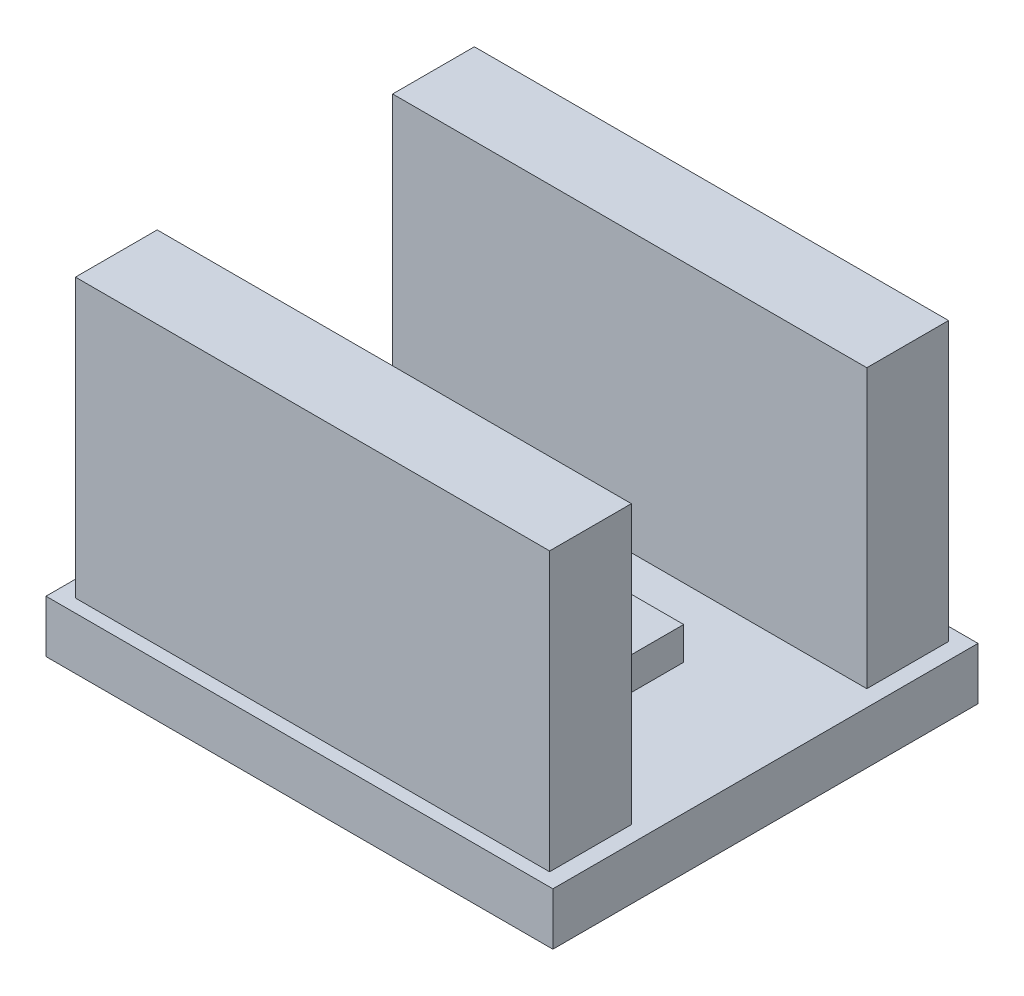
ISO-10303-21;
HEADER;
FILE_DESCRIPTION(('STEP AP214'),'2;1');
FILE_NAME('part.step','',(''),(''),'','','');
FILE_SCHEMA(('AUTOMOTIVE_DESIGN { 1 0 10303 214 1 1 1 1 }'));
ENDSEC;
DATA;
#1=APPLICATION_CONTEXT('core data for automotive mechanical design processes');
#2=APPLICATION_PROTOCOL_DEFINITION('international standard','automotive_design',2000,#1);
#3=PRODUCT_CONTEXT('',#1,'mechanical');
#4=PRODUCT('Part','Part','',(#3));
#5=PRODUCT_RELATED_PRODUCT_CATEGORY('part','',(#4));
#6=PRODUCT_DEFINITION_FORMATION('','',#4);
#7=PRODUCT_DEFINITION_CONTEXT('part definition',#1,'design');
#8=PRODUCT_DEFINITION('design','',#6,#7);
#9=PRODUCT_DEFINITION_SHAPE('','',#8);
#10=(LENGTH_UNIT() NAMED_UNIT(*) SI_UNIT(.MILLI.,.METRE.));
#11=(NAMED_UNIT(*) PLANE_ANGLE_UNIT() SI_UNIT($,.RADIAN.));
#12=(NAMED_UNIT(*) SI_UNIT($,.STERADIAN.) SOLID_ANGLE_UNIT());
#13=UNCERTAINTY_MEASURE_WITH_UNIT(LENGTH_MEASURE(1.E-05),#10,'distance_accuracy_value','');
#14=(GEOMETRIC_REPRESENTATION_CONTEXT(3) GLOBAL_UNCERTAINTY_ASSIGNED_CONTEXT((#13)) GLOBAL_UNIT_ASSIGNED_CONTEXT((#10,
#11,#12)) REPRESENTATION_CONTEXT('',''));
#15=CARTESIAN_POINT('',(0.,0.,0.));
#16=DIRECTION('',(0.,0.,1.));
#17=DIRECTION('',(1.,0.,0.));
#18=AXIS2_PLACEMENT_3D('',#15,#16,#17);
#19=CARTESIAN_POINT('',(0.,1.6,0.));
#20=DIRECTION('',(0.,-1.,0.));
#21=DIRECTION('',(0.,0.,-1.));
#22=AXIS2_PLACEMENT_3D('',#19,#20,#21);
#23=PLANE('',#22);
#24=DIRECTION('',(0.,0.,1.));
#25=VECTOR('',#24,1.);
#26=CARTESIAN_POINT('',(0.5,1.6,-10.1));
#27=LINE('',#26,#25);
#28=CARTESIAN_POINT('',(0.5,1.6,-12.6));
#29=VERTEX_POINT('',#28);
#30=CARTESIAN_POINT('',(0.5,1.6,-10.1));
#31=VERTEX_POINT('',#30);
#32=EDGE_CURVE('E190',#29,#31,#27,.T.);
#33=ORIENTED_EDGE('',*,*,#32,.F.);
#34=DIRECTION('',(-1.,0.,0.));
#35=VECTOR('',#34,1.);
#36=CARTESIAN_POINT('',(0.5,1.6,-12.6));
#37=LINE('',#36,#35);
#38=CARTESIAN_POINT('',(15.,1.6,-12.6));
#39=VERTEX_POINT('',#38);
#40=EDGE_CURVE('E201',#39,#29,#37,.T.);
#41=ORIENTED_EDGE('',*,*,#40,.F.);
#42=DIRECTION('',(0.,0.,-1.));
#43=VECTOR('',#42,1.);
#44=CARTESIAN_POINT('',(15.,1.6,-10.1));
#45=LINE('',#44,#43);
#46=CARTESIAN_POINT('',(15.,1.6,-10.1));
#47=VERTEX_POINT('',#46);
#48=EDGE_CURVE('E216',#47,#39,#45,.T.);
#49=ORIENTED_EDGE('',*,*,#48,.F.);
#50=DIRECTION('',(1.,0.,0.));
#51=VECTOR('',#50,1.);
#52=CARTESIAN_POINT('',(0.5,1.6,-10.1));
#53=LINE('',#52,#51);
#54=EDGE_CURVE('E195',#31,#47,#53,.T.);
#55=ORIENTED_EDGE('',*,*,#54,.F.);
#56=EDGE_LOOP('',(#33,#41,#49,#55));
#57=FACE_BOUND('',#56,.T.);
#58=DIRECTION('',(0.,0.,1.));
#59=VECTOR('',#58,1.);
#60=CARTESIAN_POINT('',(0.,1.6,0.));
#61=LINE('',#60,#59);
#62=CARTESIAN_POINT('',(0.,1.6,-13.));
#63=VERTEX_POINT('',#62);
#64=CARTESIAN_POINT('',(0.,1.6,0.));
#65=VERTEX_POINT('',#64);
#66=EDGE_CURVE('E283',#63,#65,#61,.T.);
#67=ORIENTED_EDGE('',*,*,#66,.T.);
#68=DIRECTION('',(1.,0.,0.));
#69=VECTOR('',#68,1.);
#70=CARTESIAN_POINT('',(0.,1.6,0.));
#71=LINE('',#70,#69);
#72=CARTESIAN_POINT('',(15.5,1.6,0.));
#73=VERTEX_POINT('',#72);
#74=EDGE_CURVE('E288',#65,#73,#71,.T.);
#75=ORIENTED_EDGE('',*,*,#74,.T.);
#76=DIRECTION('',(0.,0.,-1.));
#77=VECTOR('',#76,1.);
#78=CARTESIAN_POINT('',(15.5,1.6,0.));
#79=LINE('',#78,#77);
#80=CARTESIAN_POINT('',(15.5,1.6,-13.));
#81=VERTEX_POINT('',#80);
#82=EDGE_CURVE('E295',#73,#81,#79,.T.);
#83=ORIENTED_EDGE('',*,*,#82,.T.);
#84=DIRECTION('',(-1.,0.,0.));
#85=VECTOR('',#84,1.);
#86=CARTESIAN_POINT('',(0.,1.6,-13.));
#87=LINE('',#86,#85);
#88=EDGE_CURVE('E293',#81,#63,#87,.T.);
#89=ORIENTED_EDGE('',*,*,#88,.T.);
#90=EDGE_LOOP('',(#67,#75,#83,#89));
#91=FACE_BOUND('',#90,.T.);
#92=DIRECTION('',(0.,0.,1.));
#93=VECTOR('',#92,1.);
#94=CARTESIAN_POINT('',(0.5,1.6,-0.4));
#95=LINE('',#94,#93);
#96=CARTESIAN_POINT('',(0.5,1.6,-2.9));
#97=VERTEX_POINT('',#96);
#98=CARTESIAN_POINT('',(0.5,1.6,-0.4));
#99=VERTEX_POINT('',#98);
#100=EDGE_CURVE('E236',#97,#99,#95,.T.);
#101=ORIENTED_EDGE('',*,*,#100,.F.);
#102=DIRECTION('',(-1.,0.,0.));
#103=VECTOR('',#102,1.);
#104=CARTESIAN_POINT('',(0.5,1.6,-2.9));
#105=LINE('',#104,#103);
#106=CARTESIAN_POINT('',(15.,1.6,-2.9));
#107=VERTEX_POINT('',#106);
#108=EDGE_CURVE('E243',#107,#97,#105,.T.);
#109=ORIENTED_EDGE('',*,*,#108,.F.);
#110=DIRECTION('',(0.,0.,-1.));
#111=VECTOR('',#110,1.);
#112=CARTESIAN_POINT('',(15.,1.6,-0.4));
#113=LINE('',#112,#111);
#114=CARTESIAN_POINT('',(15.,1.6,-0.4));
#115=VERTEX_POINT('',#114);
#116=EDGE_CURVE('E261',#115,#107,#113,.T.);
#117=ORIENTED_EDGE('',*,*,#116,.F.);
#118=DIRECTION('',(1.,0.,0.));
#119=VECTOR('',#118,1.);
#120=CARTESIAN_POINT('',(0.5,1.6,-0.4));
#121=LINE('',#120,#119);
#122=EDGE_CURVE('E260',#99,#115,#121,.T.);
#123=ORIENTED_EDGE('',*,*,#122,.F.);
#124=EDGE_LOOP('',(#101,#109,#117,#123));
#125=FACE_BOUND('',#124,.T.);
#126=DIRECTION('',(0.,0.,1.));
#127=VECTOR('',#126,1.);
#128=CARTESIAN_POINT('',(4.,1.6,-5.));
#129=LINE('',#128,#127);
#130=CARTESIAN_POINT('',(4.,1.6,-8.));
#131=VERTEX_POINT('',#130);
#132=CARTESIAN_POINT('',(4.,1.6,-5.));
#133=VERTEX_POINT('',#132);
#134=EDGE_CURVE('E183',#131,#133,#129,.T.);
#135=ORIENTED_EDGE('',*,*,#134,.F.);
#136=DIRECTION('',(-1.,0.,0.));
#137=VECTOR('',#136,1.);
#138=CARTESIAN_POINT('',(4.,1.6,-8.));
#139=LINE('',#138,#137);
#140=CARTESIAN_POINT('',(11.5,1.6,-8.));
#141=VERTEX_POINT('',#140);
#142=EDGE_CURVE('E185',#141,#131,#139,.T.);
#143=ORIENTED_EDGE('',*,*,#142,.F.);
#144=DIRECTION('',(0.,0.,-1.));
#145=VECTOR('',#144,1.);
#146=CARTESIAN_POINT('',(11.5,1.6,-5.));
#147=LINE('',#146,#145);
#148=CARTESIAN_POINT('',(11.5,1.6,-5.));
#149=VERTEX_POINT('',#148);
#150=EDGE_CURVE('E69',#149,#141,#147,.T.);
#151=ORIENTED_EDGE('',*,*,#150,.F.);
#152=DIRECTION('',(1.,0.,0.));
#153=VECTOR('',#152,1.);
#154=CARTESIAN_POINT('',(4.,1.6,-5.));
#155=LINE('',#154,#153);
#156=EDGE_CURVE('E64',#133,#149,#155,.T.);
#157=ORIENTED_EDGE('',*,*,#156,.F.);
#158=EDGE_LOOP('',(#135,#143,#151,#157));
#159=FACE_BOUND('',#158,.T.);
#160=ADVANCED_FACE('F47',(#57,#91,#125,#159),#23,.F.);
#161=CARTESIAN_POINT('',(0.,1.6,0.));
#162=DIRECTION('',(1.,0.,0.));
#163=DIRECTION('',(0.,0.,-1.));
#164=AXIS2_PLACEMENT_3D('',#161,#162,#163);
#165=PLANE('',#164);
#166=DIRECTION('',(0.,0.,1.));
#167=VECTOR('',#166,1.);
#168=CARTESIAN_POINT('',(0.,0.,0.));
#169=LINE('',#168,#167);
#170=CARTESIAN_POINT('',(0.,0.,-13.));
#171=VERTEX_POINT('',#170);
#172=CARTESIAN_POINT('',(0.,0.,0.));
#173=VERTEX_POINT('',#172);
#174=EDGE_CURVE('E282',#171,#173,#169,.T.);
#175=ORIENTED_EDGE('',*,*,#174,.T.);
#176=DIRECTION('',(0.,-1.,0.));
#177=VECTOR('',#176,1.);
#178=CARTESIAN_POINT('',(0.,1.6,0.));
#179=LINE('',#178,#177);
#180=EDGE_CURVE('E11',#65,#173,#179,.T.);
#181=ORIENTED_EDGE('',*,*,#180,.F.);
#182=ORIENTED_EDGE('',*,*,#66,.F.);
#183=DIRECTION('',(0.,-1.,0.));
#184=VECTOR('',#183,1.);
#185=CARTESIAN_POINT('',(0.,1.6,-13.));
#186=LINE('',#185,#184);
#187=EDGE_CURVE('E297',#63,#171,#186,.T.);
#188=ORIENTED_EDGE('',*,*,#187,.T.);
#189=EDGE_LOOP('',(#175,#181,#182,#188));
#190=FACE_BOUND('',#189,.T.);
#191=ADVANCED_FACE('F51',(#190),#165,.F.);
#192=CARTESIAN_POINT('',(0.,1.6,0.));
#193=DIRECTION('',(0.,0.,-1.));
#194=DIRECTION('',(-1.,0.,0.));
#195=AXIS2_PLACEMENT_3D('',#192,#193,#194);
#196=PLANE('',#195);
#197=DIRECTION('',(1.,0.,0.));
#198=VECTOR('',#197,1.);
#199=CARTESIAN_POINT('',(0.,0.,0.));
#200=LINE('',#199,#198);
#201=CARTESIAN_POINT('',(15.5,0.,0.));
#202=VERTEX_POINT('',#201);
#203=EDGE_CURVE('E305',#173,#202,#200,.T.);
#204=ORIENTED_EDGE('',*,*,#203,.T.);
#205=DIRECTION('',(0.,-1.,0.));
#206=VECTOR('',#205,1.);
#207=CARTESIAN_POINT('',(15.5,1.6,0.));
#208=LINE('',#207,#206);
#209=EDGE_CURVE('E59',#73,#202,#208,.T.);
#210=ORIENTED_EDGE('',*,*,#209,.F.);
#211=ORIENTED_EDGE('',*,*,#74,.F.);
#212=ORIENTED_EDGE('',*,*,#180,.T.);
#213=EDGE_LOOP('',(#204,#210,#211,#212));
#214=FACE_BOUND('',#213,.T.);
#215=ADVANCED_FACE('F337',(#214),#196,.F.);
#216=CARTESIAN_POINT('',(15.5,1.6,0.));
#217=DIRECTION('',(-1.,0.,0.));
#218=DIRECTION('',(0.,0.,1.));
#219=AXIS2_PLACEMENT_3D('',#216,#217,#218);
#220=PLANE('',#219);
#221=DIRECTION('',(0.,0.,-1.));
#222=VECTOR('',#221,1.);
#223=CARTESIAN_POINT('',(15.5,0.,0.));
#224=LINE('',#223,#222);
#225=CARTESIAN_POINT('',(15.5,0.,-13.));
#226=VERTEX_POINT('',#225);
#227=EDGE_CURVE('E304',#202,#226,#224,.T.);
#228=ORIENTED_EDGE('',*,*,#227,.T.);
#229=DIRECTION('',(0.,-1.,0.));
#230=VECTOR('',#229,1.);
#231=CARTESIAN_POINT('',(15.5,1.6,-13.));
#232=LINE('',#231,#230);
#233=EDGE_CURVE('E311',#81,#226,#232,.T.);
#234=ORIENTED_EDGE('',*,*,#233,.F.);
#235=ORIENTED_EDGE('',*,*,#82,.F.);
#236=ORIENTED_EDGE('',*,*,#209,.T.);
#237=EDGE_LOOP('',(#228,#234,#235,#236));
#238=FACE_BOUND('',#237,.T.);
#239=ADVANCED_FACE('F325',(#238),#220,.F.);
#240=CARTESIAN_POINT('',(0.,1.6,-13.));
#241=DIRECTION('',(0.,0.,1.));
#242=DIRECTION('',(1.,0.,0.));
#243=AXIS2_PLACEMENT_3D('',#240,#241,#242);
#244=PLANE('',#243);
#245=DIRECTION('',(-1.,0.,0.));
#246=VECTOR('',#245,1.);
#247=CARTESIAN_POINT('',(0.,0.,-13.));
#248=LINE('',#247,#246);
#249=EDGE_CURVE('E287',#226,#171,#248,.T.);
#250=ORIENTED_EDGE('',*,*,#249,.T.);
#251=ORIENTED_EDGE('',*,*,#187,.F.);
#252=ORIENTED_EDGE('',*,*,#88,.F.);
#253=ORIENTED_EDGE('',*,*,#233,.T.);
#254=EDGE_LOOP('',(#250,#251,#252,#253));
#255=FACE_BOUND('',#254,.T.);
#256=ADVANCED_FACE('F332',(#255),#244,.F.);
#257=CARTESIAN_POINT('',(0.,0.,0.));
#258=DIRECTION('',(0.,-1.,0.));
#259=DIRECTION('',(0.,0.,-1.));
#260=AXIS2_PLACEMENT_3D('',#257,#258,#259);
#261=PLANE('',#260);
#262=ORIENTED_EDGE('',*,*,#174,.F.);
#263=ORIENTED_EDGE('',*,*,#249,.F.);
#264=ORIENTED_EDGE('',*,*,#227,.F.);
#265=ORIENTED_EDGE('',*,*,#203,.F.);
#266=EDGE_LOOP('',(#262,#263,#264,#265));
#267=FACE_BOUND('',#266,.T.);
#268=ADVANCED_FACE('F327',(#267),#261,.T.);
#269=CARTESIAN_POINT('',(0.5,10.1,-0.4));
#270=DIRECTION('',(1.,0.,0.));
#271=DIRECTION('',(0.,0.,-1.));
#272=AXIS2_PLACEMENT_3D('',#269,#270,#271);
#273=PLANE('',#272);
#274=ORIENTED_EDGE('',*,*,#100,.T.);
#275=DIRECTION('',(0.,-1.,0.));
#276=VECTOR('',#275,1.);
#277=CARTESIAN_POINT('',(0.5,10.1,-0.4));
#278=LINE('',#277,#276);
#279=CARTESIAN_POINT('',(0.5,10.1,-0.4));
#280=VERTEX_POINT('',#279);
#281=EDGE_CURVE('E276',#280,#99,#278,.T.);
#282=ORIENTED_EDGE('',*,*,#281,.F.);
#283=DIRECTION('',(0.,0.,1.));
#284=VECTOR('',#283,1.);
#285=CARTESIAN_POINT('',(0.5,10.1,-0.4));
#286=LINE('',#285,#284);
#287=CARTESIAN_POINT('',(0.5,10.1,-2.9));
#288=VERTEX_POINT('',#287);
#289=EDGE_CURVE('E239',#288,#280,#286,.T.);
#290=ORIENTED_EDGE('',*,*,#289,.F.);
#291=DIRECTION('',(0.,-1.,0.));
#292=VECTOR('',#291,1.);
#293=CARTESIAN_POINT('',(0.5,10.1,-2.9));
#294=LINE('',#293,#292);
#295=EDGE_CURVE('E251',#288,#97,#294,.T.);
#296=ORIENTED_EDGE('',*,*,#295,.T.);
#297=EDGE_LOOP('',(#274,#282,#290,#296));
#298=FACE_BOUND('',#297,.T.);
#299=ADVANCED_FACE('F355',(#298),#273,.F.);
#300=CARTESIAN_POINT('',(0.5,10.1,-0.4));
#301=DIRECTION('',(0.,0.,-1.));
#302=DIRECTION('',(-1.,0.,0.));
#303=AXIS2_PLACEMENT_3D('',#300,#301,#302);
#304=PLANE('',#303);
#305=ORIENTED_EDGE('',*,*,#122,.T.);
#306=DIRECTION('',(0.,-1.,0.));
#307=VECTOR('',#306,1.);
#308=CARTESIAN_POINT('',(15.,10.1,-0.4));
#309=LINE('',#308,#307);
#310=CARTESIAN_POINT('',(15.,10.1,-0.4));
#311=VERTEX_POINT('',#310);
#312=EDGE_CURVE('E274',#311,#115,#309,.T.);
#313=ORIENTED_EDGE('',*,*,#312,.F.);
#314=DIRECTION('',(1.,0.,0.));
#315=VECTOR('',#314,1.);
#316=CARTESIAN_POINT('',(0.5,10.1,-0.4));
#317=LINE('',#316,#315);
#318=EDGE_CURVE('E242',#280,#311,#317,.T.);
#319=ORIENTED_EDGE('',*,*,#318,.F.);
#320=ORIENTED_EDGE('',*,*,#281,.T.);
#321=EDGE_LOOP('',(#305,#313,#319,#320));
#322=FACE_BOUND('',#321,.T.);
#323=ADVANCED_FACE('F371',(#322),#304,.F.);
#324=CARTESIAN_POINT('',(15.,10.1,-0.4));
#325=DIRECTION('',(-1.,0.,0.));
#326=DIRECTION('',(0.,0.,1.));
#327=AXIS2_PLACEMENT_3D('',#324,#325,#326);
#328=PLANE('',#327);
#329=ORIENTED_EDGE('',*,*,#116,.T.);
#330=DIRECTION('',(0.,-1.,0.));
#331=VECTOR('',#330,1.);
#332=CARTESIAN_POINT('',(15.,10.1,-2.9));
#333=LINE('',#332,#331);
#334=CARTESIAN_POINT('',(15.,10.1,-2.9));
#335=VERTEX_POINT('',#334);
#336=EDGE_CURVE('E271',#335,#107,#333,.T.);
#337=ORIENTED_EDGE('',*,*,#336,.F.);
#338=DIRECTION('',(0.,0.,-1.));
#339=VECTOR('',#338,1.);
#340=CARTESIAN_POINT('',(15.,10.1,-0.4));
#341=LINE('',#340,#339);
#342=EDGE_CURVE('E250',#311,#335,#341,.T.);
#343=ORIENTED_EDGE('',*,*,#342,.F.);
#344=ORIENTED_EDGE('',*,*,#312,.T.);
#345=EDGE_LOOP('',(#329,#337,#343,#344));
#346=FACE_BOUND('',#345,.T.);
#347=ADVANCED_FACE('F378',(#346),#328,.F.);
#348=CARTESIAN_POINT('',(0.5,10.1,-2.9));
#349=DIRECTION('',(0.,0.,1.));
#350=DIRECTION('',(1.,0.,0.));
#351=AXIS2_PLACEMENT_3D('',#348,#349,#350);
#352=PLANE('',#351);
#353=ORIENTED_EDGE('',*,*,#108,.T.);
#354=ORIENTED_EDGE('',*,*,#295,.F.);
#355=DIRECTION('',(-1.,0.,0.));
#356=VECTOR('',#355,1.);
#357=CARTESIAN_POINT('',(0.5,10.1,-2.9));
#358=LINE('',#357,#356);
#359=EDGE_CURVE('E249',#335,#288,#358,.T.);
#360=ORIENTED_EDGE('',*,*,#359,.F.);
#361=ORIENTED_EDGE('',*,*,#336,.T.);
#362=EDGE_LOOP('',(#353,#354,#360,#361));
#363=FACE_BOUND('',#362,.T.);
#364=ADVANCED_FACE('F384',(#363),#352,.F.);
#365=CARTESIAN_POINT('',(0.,10.1,0.));
#366=DIRECTION('',(0.,-1.,0.));
#367=DIRECTION('',(0.,0.,-1.));
#368=AXIS2_PLACEMENT_3D('',#365,#366,#367);
#369=PLANE('',#368);
#370=ORIENTED_EDGE('',*,*,#289,.T.);
#371=ORIENTED_EDGE('',*,*,#318,.T.);
#372=ORIENTED_EDGE('',*,*,#342,.T.);
#373=ORIENTED_EDGE('',*,*,#359,.T.);
#374=EDGE_LOOP('',(#370,#371,#372,#373));
#375=FACE_BOUND('',#374,.T.);
#376=ADVANCED_FACE('F392',(#375),#369,.F.);
#377=CARTESIAN_POINT('',(0.5,10.1,-10.1));
#378=DIRECTION('',(1.,0.,0.));
#379=DIRECTION('',(0.,0.,-1.));
#380=AXIS2_PLACEMENT_3D('',#377,#378,#379);
#381=PLANE('',#380);
#382=ORIENTED_EDGE('',*,*,#32,.T.);
#383=DIRECTION('',(0.,-1.,0.));
#384=VECTOR('',#383,1.);
#385=CARTESIAN_POINT('',(0.5,10.1,-10.1));
#386=LINE('',#385,#384);
#387=CARTESIAN_POINT('',(0.5,10.1,-10.1));
#388=VERTEX_POINT('',#387);
#389=EDGE_CURVE('E232',#388,#31,#386,.T.);
#390=ORIENTED_EDGE('',*,*,#389,.F.);
#391=DIRECTION('',(0.,0.,1.));
#392=VECTOR('',#391,1.);
#393=CARTESIAN_POINT('',(0.5,10.1,-10.1));
#394=LINE('',#393,#392);
#395=CARTESIAN_POINT('',(0.5,10.1,-12.6));
#396=VERTEX_POINT('',#395);
#397=EDGE_CURVE('E196',#396,#388,#394,.T.);
#398=ORIENTED_EDGE('',*,*,#397,.F.);
#399=DIRECTION('',(0.,-1.,0.));
#400=VECTOR('',#399,1.);
#401=CARTESIAN_POINT('',(0.5,10.1,-12.6));
#402=LINE('',#401,#400);
#403=EDGE_CURVE('E211',#396,#29,#402,.T.);
#404=ORIENTED_EDGE('',*,*,#403,.T.);
#405=EDGE_LOOP('',(#382,#390,#398,#404));
#406=FACE_BOUND('',#405,.T.);
#407=ADVANCED_FACE('F402',(#406),#381,.F.);
#408=CARTESIAN_POINT('',(0.5,10.1,-10.1));
#409=DIRECTION('',(0.,0.,-1.));
#410=DIRECTION('',(-1.,0.,0.));
#411=AXIS2_PLACEMENT_3D('',#408,#409,#410);
#412=PLANE('',#411);
#413=ORIENTED_EDGE('',*,*,#54,.T.);
#414=DIRECTION('',(0.,-1.,0.));
#415=VECTOR('',#414,1.);
#416=CARTESIAN_POINT('',(15.,10.1,-10.1));
#417=LINE('',#416,#415);
#418=CARTESIAN_POINT('',(15.,10.1,-10.1));
#419=VERTEX_POINT('',#418);
#420=EDGE_CURVE('E229',#419,#47,#417,.T.);
#421=ORIENTED_EDGE('',*,*,#420,.F.);
#422=DIRECTION('',(1.,0.,0.));
#423=VECTOR('',#422,1.);
#424=CARTESIAN_POINT('',(0.5,10.1,-10.1));
#425=LINE('',#424,#423);
#426=EDGE_CURVE('E205',#388,#419,#425,.T.);
#427=ORIENTED_EDGE('',*,*,#426,.F.);
#428=ORIENTED_EDGE('',*,*,#389,.T.);
#429=EDGE_LOOP('',(#413,#421,#427,#428));
#430=FACE_BOUND('',#429,.T.);
#431=ADVANCED_FACE('F408',(#430),#412,.F.);
#432=CARTESIAN_POINT('',(15.,10.1,-10.1));
#433=DIRECTION('',(-1.,0.,0.));
#434=DIRECTION('',(0.,0.,1.));
#435=AXIS2_PLACEMENT_3D('',#432,#433,#434);
#436=PLANE('',#435);
#437=ORIENTED_EDGE('',*,*,#48,.T.);
#438=DIRECTION('',(0.,-1.,0.));
#439=VECTOR('',#438,1.);
#440=CARTESIAN_POINT('',(15.,10.1,-12.6));
#441=LINE('',#440,#439);
#442=CARTESIAN_POINT('',(15.,10.1,-12.6));
#443=VERTEX_POINT('',#442);
#444=EDGE_CURVE('E226',#443,#39,#441,.T.);
#445=ORIENTED_EDGE('',*,*,#444,.F.);
#446=DIRECTION('',(0.,0.,-1.));
#447=VECTOR('',#446,1.);
#448=CARTESIAN_POINT('',(15.,10.1,-10.1));
#449=LINE('',#448,#447);
#450=EDGE_CURVE('E206',#419,#443,#449,.T.);
#451=ORIENTED_EDGE('',*,*,#450,.F.);
#452=ORIENTED_EDGE('',*,*,#420,.T.);
#453=EDGE_LOOP('',(#437,#445,#451,#452));
#454=FACE_BOUND('',#453,.T.);
#455=ADVANCED_FACE('F417',(#454),#436,.F.);
#456=CARTESIAN_POINT('',(0.5,10.1,-12.6));
#457=DIRECTION('',(0.,0.,1.));
#458=DIRECTION('',(1.,0.,0.));
#459=AXIS2_PLACEMENT_3D('',#456,#457,#458);
#460=PLANE('',#459);
#461=ORIENTED_EDGE('',*,*,#40,.T.);
#462=ORIENTED_EDGE('',*,*,#403,.F.);
#463=DIRECTION('',(-1.,0.,0.));
#464=VECTOR('',#463,1.);
#465=CARTESIAN_POINT('',(0.5,10.1,-12.6));
#466=LINE('',#465,#464);
#467=EDGE_CURVE('E207',#443,#396,#466,.T.);
#468=ORIENTED_EDGE('',*,*,#467,.F.);
#469=ORIENTED_EDGE('',*,*,#444,.T.);
#470=EDGE_LOOP('',(#461,#462,#468,#469));
#471=FACE_BOUND('',#470,.T.);
#472=ADVANCED_FACE('F422',(#471),#460,.F.);
#473=CARTESIAN_POINT('',(0.,10.1,0.));
#474=DIRECTION('',(0.,-1.,0.));
#475=DIRECTION('',(0.,0.,-1.));
#476=AXIS2_PLACEMENT_3D('',#473,#474,#475);
#477=PLANE('',#476);
#478=ORIENTED_EDGE('',*,*,#397,.T.);
#479=ORIENTED_EDGE('',*,*,#426,.T.);
#480=ORIENTED_EDGE('',*,*,#450,.T.);
#481=ORIENTED_EDGE('',*,*,#467,.T.);
#482=EDGE_LOOP('',(#478,#479,#480,#481));
#483=FACE_BOUND('',#482,.T.);
#484=ADVANCED_FACE('F433',(#483),#477,.F.);
#485=CARTESIAN_POINT('',(4.,2.6,-5.));
#486=DIRECTION('',(1.,0.,0.));
#487=DIRECTION('',(0.,0.,-1.));
#488=AXIS2_PLACEMENT_3D('',#485,#486,#487);
#489=PLANE('',#488);
#490=ORIENTED_EDGE('',*,*,#134,.T.);
#491=DIRECTION('',(0.,-1.,0.));
#492=VECTOR('',#491,1.);
#493=CARTESIAN_POINT('',(4.,2.6,-5.));
#494=LINE('',#493,#492);
#495=CARTESIAN_POINT('',(4.,2.6,-5.));
#496=VERTEX_POINT('',#495);
#497=EDGE_CURVE('E163',#496,#133,#494,.T.);
#498=ORIENTED_EDGE('',*,*,#497,.F.);
#499=DIRECTION('',(0.,0.,1.));
#500=VECTOR('',#499,1.);
#501=CARTESIAN_POINT('',(4.,2.6,-5.));
#502=LINE('',#501,#500);
#503=CARTESIAN_POINT('',(4.,2.6,-8.));
#504=VERTEX_POINT('',#503);
#505=EDGE_CURVE('E175',#504,#496,#502,.T.);
#506=ORIENTED_EDGE('',*,*,#505,.F.);
#507=DIRECTION('',(0.,-1.,0.));
#508=VECTOR('',#507,1.);
#509=CARTESIAN_POINT('',(4.,2.6,-8.));
#510=LINE('',#509,#508);
#511=EDGE_CURVE('E616',#504,#131,#510,.T.);
#512=ORIENTED_EDGE('',*,*,#511,.T.);
#513=EDGE_LOOP('',(#490,#498,#506,#512));
#514=FACE_BOUND('',#513,.T.);
#515=ADVANCED_FACE('F184',(#514),#489,.F.);
#516=CARTESIAN_POINT('',(4.,2.6,-5.));
#517=DIRECTION('',(0.,0.,-1.));
#518=DIRECTION('',(-1.,0.,0.));
#519=AXIS2_PLACEMENT_3D('',#516,#517,#518);
#520=PLANE('',#519);
#521=ORIENTED_EDGE('',*,*,#156,.T.);
#522=DIRECTION('',(0.,-1.,0.));
#523=VECTOR('',#522,1.);
#524=CARTESIAN_POINT('',(11.5,2.6,-5.));
#525=LINE('',#524,#523);
#526=CARTESIAN_POINT('',(11.5,2.6,-5.));
#527=VERTEX_POINT('',#526);
#528=EDGE_CURVE('E170',#527,#149,#525,.T.);
#529=ORIENTED_EDGE('',*,*,#528,.F.);
#530=DIRECTION('',(1.,0.,0.));
#531=VECTOR('',#530,1.);
#532=CARTESIAN_POINT('',(4.,2.6,-5.));
#533=LINE('',#532,#531);
#534=EDGE_CURVE('E159',#496,#527,#533,.T.);
#535=ORIENTED_EDGE('',*,*,#534,.F.);
#536=ORIENTED_EDGE('',*,*,#497,.T.);
#537=EDGE_LOOP('',(#521,#529,#535,#536));
#538=FACE_BOUND('',#537,.T.);
#539=ADVANCED_FACE('F165',(#538),#520,.F.);
#540=CARTESIAN_POINT('',(11.5,2.6,-5.));
#541=DIRECTION('',(-1.,0.,0.));
#542=DIRECTION('',(0.,0.,1.));
#543=AXIS2_PLACEMENT_3D('',#540,#541,#542);
#544=PLANE('',#543);
#545=ORIENTED_EDGE('',*,*,#150,.T.);
#546=DIRECTION('',(0.,-1.,0.));
#547=VECTOR('',#546,1.);
#548=CARTESIAN_POINT('',(11.5,2.6,-8.));
#549=LINE('',#548,#547);
#550=CARTESIAN_POINT('',(11.5,2.6,-8.));
#551=VERTEX_POINT('',#550);
#552=EDGE_CURVE('E192',#551,#141,#549,.T.);
#553=ORIENTED_EDGE('',*,*,#552,.F.);
#554=DIRECTION('',(0.,0.,-1.));
#555=VECTOR('',#554,1.);
#556=CARTESIAN_POINT('',(11.5,2.6,-5.));
#557=LINE('',#556,#555);
#558=EDGE_CURVE('E171',#527,#551,#557,.T.);
#559=ORIENTED_EDGE('',*,*,#558,.F.);
#560=ORIENTED_EDGE('',*,*,#528,.T.);
#561=EDGE_LOOP('',(#545,#553,#559,#560));
#562=FACE_BOUND('',#561,.T.);
#563=ADVANCED_FACE('F452',(#562),#544,.F.);
#564=CARTESIAN_POINT('',(4.,2.6,-8.));
#565=DIRECTION('',(0.,0.,1.));
#566=DIRECTION('',(1.,0.,0.));
#567=AXIS2_PLACEMENT_3D('',#564,#565,#566);
#568=PLANE('',#567);
#569=ORIENTED_EDGE('',*,*,#142,.T.);
#570=ORIENTED_EDGE('',*,*,#511,.F.);
#571=DIRECTION('',(-1.,0.,0.));
#572=VECTOR('',#571,1.);
#573=CARTESIAN_POINT('',(4.,2.6,-8.));
#574=LINE('',#573,#572);
#575=EDGE_CURVE('E180',#551,#504,#574,.T.);
#576=ORIENTED_EDGE('',*,*,#575,.F.);
#577=ORIENTED_EDGE('',*,*,#552,.T.);
#578=EDGE_LOOP('',(#569,#570,#576,#577));
#579=FACE_BOUND('',#578,.T.);
#580=ADVANCED_FACE('F461',(#579),#568,.F.);
#581=CARTESIAN_POINT('',(0.,2.6,0.));
#582=DIRECTION('',(0.,-1.,0.));
#583=DIRECTION('',(0.,0.,-1.));
#584=AXIS2_PLACEMENT_3D('',#581,#582,#583);
#585=PLANE('',#584);
#586=ORIENTED_EDGE('',*,*,#505,.T.);
#587=ORIENTED_EDGE('',*,*,#534,.T.);
#588=ORIENTED_EDGE('',*,*,#558,.T.);
#589=ORIENTED_EDGE('',*,*,#575,.T.);
#590=EDGE_LOOP('',(#586,#587,#588,#589));
#591=FACE_BOUND('',#590,.T.);
#592=ADVANCED_FACE('F174',(#591),#585,.F.);
#593=CLOSED_SHELL('',(#160,#191,#215,#239,#256,#268,#299,#323,#347,#364,#376,#407,#431,#455,
#472,#484,#515,#539,#563,#580,#592));
#594=MANIFOLD_SOLID_BREP('B2',#593);
#595=ADVANCED_BREP_SHAPE_REPRESENTATION('',(#18,#594),#14);
#596=SHAPE_DEFINITION_REPRESENTATION(#9,#595);
ENDSEC;
END-ISO-10303-21;
